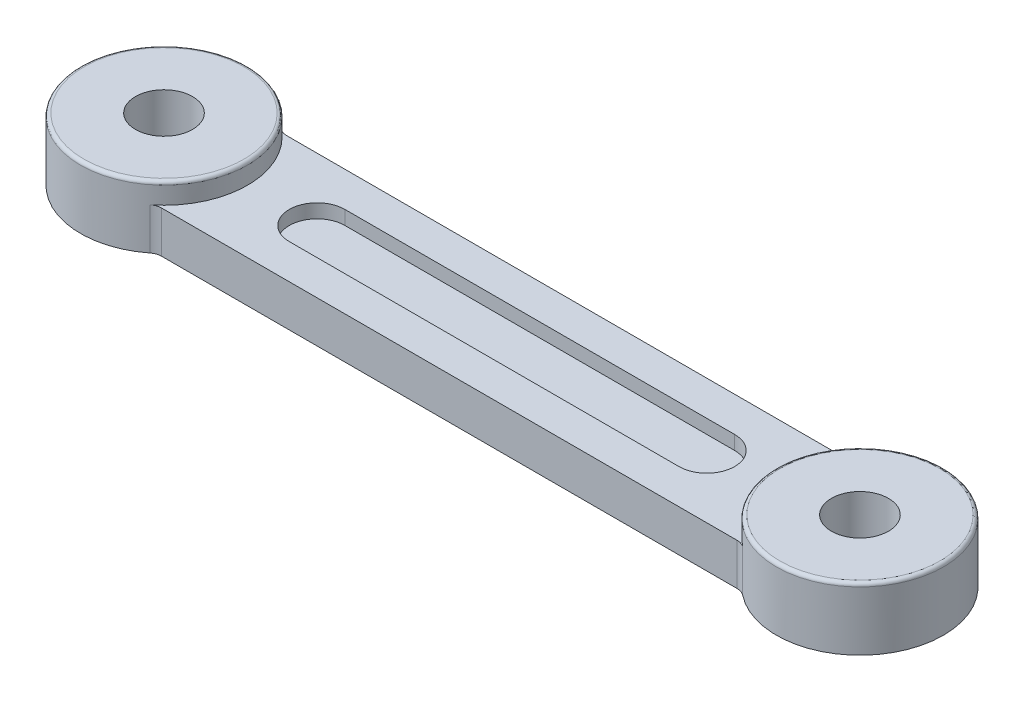
ISO-10303-21;
HEADER;
FILE_DESCRIPTION(('STEP AP214'),'2;1');
FILE_NAME('part.step','',(''),(''),'','','');
FILE_SCHEMA(('AUTOMOTIVE_DESIGN { 1 0 10303 214 1 1 1 1 }'));
ENDSEC;
DATA;
#1=APPLICATION_CONTEXT('core data for automotive mechanical design processes');
#2=APPLICATION_PROTOCOL_DEFINITION('international standard','automotive_design',2000,#1);
#3=PRODUCT_CONTEXT('',#1,'mechanical');
#4=PRODUCT('Part','Part','',(#3));
#5=PRODUCT_RELATED_PRODUCT_CATEGORY('part','',(#4));
#6=PRODUCT_DEFINITION_FORMATION('','',#4);
#7=PRODUCT_DEFINITION_CONTEXT('part definition',#1,'design');
#8=PRODUCT_DEFINITION('design','',#6,#7);
#9=PRODUCT_DEFINITION_SHAPE('','',#8);
#10=(LENGTH_UNIT() NAMED_UNIT(*) SI_UNIT(.MILLI.,.METRE.));
#11=(NAMED_UNIT(*) PLANE_ANGLE_UNIT() SI_UNIT($,.RADIAN.));
#12=(NAMED_UNIT(*) SI_UNIT($,.STERADIAN.) SOLID_ANGLE_UNIT());
#13=UNCERTAINTY_MEASURE_WITH_UNIT(LENGTH_MEASURE(1.E-05),#10,'distance_accuracy_value','');
#14=(GEOMETRIC_REPRESENTATION_CONTEXT(3) GLOBAL_UNCERTAINTY_ASSIGNED_CONTEXT((#13)) GLOBAL_UNIT_ASSIGNED_CONTEXT((#10,
#11,#12)) REPRESENTATION_CONTEXT('',''));
#15=CARTESIAN_POINT('',(0.,0.,0.));
#16=DIRECTION('',(0.,0.,1.));
#17=DIRECTION('',(1.,0.,0.));
#18=AXIS2_PLACEMENT_3D('',#15,#16,#17);
#19=CARTESIAN_POINT('',(-50.,6.,9.));
#20=DIRECTION('',(0.,0.,-1.));
#21=DIRECTION('',(-1.,0.,0.));
#22=AXIS2_PLACEMENT_3D('',#19,#20,#21);
#23=PLANE('',#22);
#24=DIRECTION('',(1.,0.,0.));
#25=VECTOR('',#24,1.);
#26=CARTESIAN_POINT('',(-50.,0.,9.));
#27=LINE('',#26,#25);
#28=CARTESIAN_POINT('',(-41.3397459621556,0.,9.));
#29=VERTEX_POINT('',#28);
#30=CARTESIAN_POINT('',(41.3397459621556,0.,8.99999999999998));
#31=VERTEX_POINT('',#30);
#32=EDGE_CURVE('E186',#29,#31,#27,.T.);
#33=ORIENTED_EDGE('',*,*,#32,.T.);
#34=DIRECTION('',(0.,1.,0.));
#35=VECTOR('',#34,1.);
#36=CARTESIAN_POINT('',(41.3397459621556,6.,8.99999999999998));
#37=LINE('',#36,#35);
#38=CARTESIAN_POINT('',(41.3397459621556,6.,8.99999999999998));
#39=VERTEX_POINT('',#38);
#40=EDGE_CURVE('E228',#31,#39,#37,.T.);
#41=ORIENTED_EDGE('',*,*,#40,.T.);
#42=DIRECTION('',(1.,0.,0.));
#43=VECTOR('',#42,1.);
#44=CARTESIAN_POINT('',(-50.,6.,9.));
#45=LINE('',#44,#43);
#46=CARTESIAN_POINT('',(-41.3397459621556,6.,9.));
#47=VERTEX_POINT('',#46);
#48=EDGE_CURVE('E187',#47,#39,#45,.T.);
#49=ORIENTED_EDGE('',*,*,#48,.F.);
#50=DIRECTION('',(0.,1.,0.));
#51=VECTOR('',#50,1.);
#52=CARTESIAN_POINT('',(-41.3397459621556,0.,9.));
#53=LINE('',#52,#51);
#54=EDGE_CURVE('E225',#47,#29,#53,.F.);
#55=ORIENTED_EDGE('',*,*,#54,.T.);
#56=EDGE_LOOP('',(#33,#41,#49,#55));
#57=FACE_BOUND('',#56,.T.);
#58=ADVANCED_FACE('F35',(#57),#23,.F.);
#59=CARTESIAN_POINT('',(-50.,6.,-9.));
#60=DIRECTION('',(0.,0.,1.));
#61=DIRECTION('',(1.,0.,0.));
#62=AXIS2_PLACEMENT_3D('',#59,#60,#61);
#63=PLANE('',#62);
#64=DIRECTION('',(-1.,0.,0.));
#65=VECTOR('',#64,1.);
#66=CARTESIAN_POINT('',(-50.,0.,-9.));
#67=LINE('',#66,#65);
#68=CARTESIAN_POINT('',(41.3397459621556,0.,-9.00000000000002));
#69=VERTEX_POINT('',#68);
#70=CARTESIAN_POINT('',(-41.3397459621556,0.,-9.));
#71=VERTEX_POINT('',#70);
#72=EDGE_CURVE('E190',#69,#71,#67,.T.);
#73=ORIENTED_EDGE('',*,*,#72,.T.);
#74=DIRECTION('',(0.,1.,0.));
#75=VECTOR('',#74,1.);
#76=CARTESIAN_POINT('',(-41.3397459621556,6.,-9.));
#77=LINE('',#76,#75);
#78=CARTESIAN_POINT('',(-41.3397459621556,6.,-9.));
#79=VERTEX_POINT('',#78);
#80=EDGE_CURVE('E212',#71,#79,#77,.T.);
#81=ORIENTED_EDGE('',*,*,#80,.T.);
#82=DIRECTION('',(-1.,0.,0.));
#83=VECTOR('',#82,1.);
#84=CARTESIAN_POINT('',(-50.,6.,-9.));
#85=LINE('',#84,#83);
#86=CARTESIAN_POINT('',(41.3397459621556,6.,-9.00000000000002));
#87=VERTEX_POINT('',#86);
#88=EDGE_CURVE('E189',#87,#79,#85,.T.);
#89=ORIENTED_EDGE('',*,*,#88,.F.);
#90=DIRECTION('',(0.,1.,0.));
#91=VECTOR('',#90,1.);
#92=CARTESIAN_POINT('',(41.3397459621556,0.,-9.00000000000002));
#93=LINE('',#92,#91);
#94=EDGE_CURVE('E209',#87,#69,#93,.F.);
#95=ORIENTED_EDGE('',*,*,#94,.T.);
#96=EDGE_LOOP('',(#73,#81,#89,#95));
#97=FACE_BOUND('',#96,.T.);
#98=ADVANCED_FACE('F271',(#97),#63,.F.);
#99=CARTESIAN_POINT('',(-50.,6.,0.));
#100=DIRECTION('',(0.,1.,0.));
#101=DIRECTION('',(0.,0.,1.));
#102=AXIS2_PLACEMENT_3D('',#99,#100,#101);
#103=PLANE('',#102);
#104=CARTESIAN_POINT('',(-28.,6.,0.));
#105=DIRECTION('',(0.,1.,0.));
#106=DIRECTION('',(0.,0.,1.));
#107=AXIS2_PLACEMENT_3D('',#104,#105,#106);
#108=CIRCLE('',#107,4.);
#109=CARTESIAN_POINT('',(-28.,6.,-4.));
#110=VERTEX_POINT('',#109);
#111=CARTESIAN_POINT('',(-28.,6.,4.));
#112=VERTEX_POINT('',#111);
#113=EDGE_CURVE('E132',#110,#112,#108,.T.);
#114=ORIENTED_EDGE('',*,*,#113,.F.);
#115=DIRECTION('',(-1.,0.,0.));
#116=VECTOR('',#115,1.);
#117=CARTESIAN_POINT('',(-28.,6.,-4.));
#118=LINE('',#117,#116);
#119=CARTESIAN_POINT('',(28.,6.,-4.));
#120=VERTEX_POINT('',#119);
#121=EDGE_CURVE('E149',#120,#110,#118,.T.);
#122=ORIENTED_EDGE('',*,*,#121,.F.);
#123=CARTESIAN_POINT('',(28.,6.,0.));
#124=DIRECTION('',(0.,1.,0.));
#125=DIRECTION('',(0.,0.,1.));
#126=AXIS2_PLACEMENT_3D('',#123,#124,#125);
#127=CIRCLE('',#126,4.);
#128=CARTESIAN_POINT('',(28.,6.,4.));
#129=VERTEX_POINT('',#128);
#130=EDGE_CURVE('E152',#129,#120,#127,.T.);
#131=ORIENTED_EDGE('',*,*,#130,.F.);
#132=DIRECTION('',(1.,0.,0.));
#133=VECTOR('',#132,1.);
#134=CARTESIAN_POINT('',(-28.,6.,4.));
#135=LINE('',#134,#133);
#136=EDGE_CURVE('E161',#112,#129,#135,.T.);
#137=ORIENTED_EDGE('',*,*,#136,.F.);
#138=EDGE_LOOP('',(#114,#122,#131,#137));
#139=FACE_BOUND('',#138,.T.);
#140=CARTESIAN_POINT('',(-50.,6.,0.));
#141=DIRECTION('',(0.,1.,0.));
#142=DIRECTION('',(0.,0.,1.));
#143=AXIS2_PLACEMENT_3D('',#140,#141,#142);
#144=CIRCLE('',#143,12.);
#145=CARTESIAN_POINT('',(-42.5769251104191,6.,9.42857142857143));
#146=VERTEX_POINT('',#145);
#147=CARTESIAN_POINT('',(-42.5769251104191,6.,-9.42857142857143));
#148=VERTEX_POINT('',#147);
#149=EDGE_CURVE('E184',#146,#148,#144,.T.);
#150=ORIENTED_EDGE('',*,*,#149,.F.);
#151=CARTESIAN_POINT('',(-41.3397459621556,6.,11.));
#152=DIRECTION('',(0.,1.,0.));
#153=DIRECTION('',(0.,0.,1.));
#154=AXIS2_PLACEMENT_3D('',#151,#152,#153);
#155=CIRCLE('',#154,2.);
#156=EDGE_CURVE('E11',#146,#47,#155,.F.);
#157=ORIENTED_EDGE('',*,*,#156,.T.);
#158=ORIENTED_EDGE('',*,*,#48,.T.);
#159=CARTESIAN_POINT('',(41.3397459621556,6.,11.));
#160=DIRECTION('',(0.,1.,0.));
#161=DIRECTION('',(0.,0.,1.));
#162=AXIS2_PLACEMENT_3D('',#159,#160,#161);
#163=CIRCLE('',#162,2.);
#164=CARTESIAN_POINT('',(42.5769251104191,6.,9.42857142857141));
#165=VERTEX_POINT('',#164);
#166=EDGE_CURVE('E50',#39,#165,#163,.F.);
#167=ORIENTED_EDGE('',*,*,#166,.T.);
#168=CARTESIAN_POINT('',(50.,6.,0.));
#169=DIRECTION('',(0.,1.,0.));
#170=DIRECTION('',(0.,0.,1.));
#171=AXIS2_PLACEMENT_3D('',#168,#169,#170);
#172=CIRCLE('',#171,12.);
#173=CARTESIAN_POINT('',(42.5769251104191,6.,-9.42857142857145));
#174=VERTEX_POINT('',#173);
#175=EDGE_CURVE('E174',#174,#165,#172,.T.);
#176=ORIENTED_EDGE('',*,*,#175,.F.);
#177=CARTESIAN_POINT('',(41.3397459621556,6.,-11.));
#178=DIRECTION('',(0.,1.,0.));
#179=DIRECTION('',(0.,0.,1.));
#180=AXIS2_PLACEMENT_3D('',#177,#178,#179);
#181=CIRCLE('',#180,2.);
#182=EDGE_CURVE('E237',#174,#87,#181,.F.);
#183=ORIENTED_EDGE('',*,*,#182,.T.);
#184=ORIENTED_EDGE('',*,*,#88,.T.);
#185=CARTESIAN_POINT('',(-41.3397459621556,6.,-11.));
#186=DIRECTION('',(0.,1.,0.));
#187=DIRECTION('',(0.,0.,1.));
#188=AXIS2_PLACEMENT_3D('',#185,#186,#187);
#189=CIRCLE('',#188,2.);
#190=EDGE_CURVE('E230',#79,#148,#189,.F.);
#191=ORIENTED_EDGE('',*,*,#190,.T.);
#192=EDGE_LOOP('',(#150,#157,#158,#167,#176,#183,#184,#191));
#193=FACE_BOUND('',#192,.T.);
#194=ADVANCED_FACE('F257',(#139,#193),#103,.T.);
#195=CARTESIAN_POINT('',(-50.,0.,0.));
#196=DIRECTION('',(0.,1.,0.));
#197=DIRECTION('',(0.,0.,1.));
#198=AXIS2_PLACEMENT_3D('',#195,#196,#197);
#199=PLANE('',#198);
#200=ORIENTED_EDGE('',*,*,#72,.F.);
#201=CARTESIAN_POINT('',(41.3397459621556,0.,-11.));
#202=DIRECTION('',(0.,1.,0.));
#203=DIRECTION('',(0.,0.,1.));
#204=AXIS2_PLACEMENT_3D('',#201,#202,#203);
#205=CIRCLE('',#204,2.);
#206=CARTESIAN_POINT('',(42.5769251104191,0.,-9.42857142857145));
#207=VERTEX_POINT('',#206);
#208=EDGE_CURVE('E235',#69,#207,#205,.T.);
#209=ORIENTED_EDGE('',*,*,#208,.T.);
#210=CARTESIAN_POINT('',(50.,0.,0.));
#211=DIRECTION('',(0.,-1.,0.));
#212=DIRECTION('',(0.,0.,-1.));
#213=AXIS2_PLACEMENT_3D('',#210,#211,#212);
#214=CIRCLE('',#213,12.);
#215=CARTESIAN_POINT('',(42.5769251104191,0.,9.42857142857141));
#216=VERTEX_POINT('',#215);
#217=EDGE_CURVE('E255',#207,#216,#214,.T.);
#218=ORIENTED_EDGE('',*,*,#217,.T.);
#219=CARTESIAN_POINT('',(41.3397459621556,0.,11.));
#220=DIRECTION('',(0.,1.,0.));
#221=DIRECTION('',(0.,0.,1.));
#222=AXIS2_PLACEMENT_3D('',#219,#220,#221);
#223=CIRCLE('',#222,2.);
#224=EDGE_CURVE('E240',#216,#31,#223,.T.);
#225=ORIENTED_EDGE('',*,*,#224,.T.);
#226=ORIENTED_EDGE('',*,*,#32,.F.);
#227=CARTESIAN_POINT('',(-41.3397459621556,0.,11.));
#228=DIRECTION('',(0.,1.,0.));
#229=DIRECTION('',(0.,0.,1.));
#230=AXIS2_PLACEMENT_3D('',#227,#228,#229);
#231=CIRCLE('',#230,2.);
#232=CARTESIAN_POINT('',(-42.5769251104191,0.,9.42857142857143));
#233=VERTEX_POINT('',#232);
#234=EDGE_CURVE('E43',#29,#233,#231,.T.);
#235=ORIENTED_EDGE('',*,*,#234,.T.);
#236=CARTESIAN_POINT('',(-50.,0.,0.));
#237=DIRECTION('',(0.,-1.,0.));
#238=DIRECTION('',(0.,0.,-1.));
#239=AXIS2_PLACEMENT_3D('',#236,#237,#238);
#240=CIRCLE('',#239,12.);
#241=CARTESIAN_POINT('',(-42.5769251104191,0.,-9.42857142857143));
#242=VERTEX_POINT('',#241);
#243=EDGE_CURVE('E155',#233,#242,#240,.T.);
#244=ORIENTED_EDGE('',*,*,#243,.T.);
#245=CARTESIAN_POINT('',(-41.3397459621556,0.,-11.));
#246=DIRECTION('',(0.,1.,0.));
#247=DIRECTION('',(0.,0.,1.));
#248=AXIS2_PLACEMENT_3D('',#245,#246,#247);
#249=CIRCLE('',#248,2.);
#250=EDGE_CURVE('E233',#242,#71,#249,.T.);
#251=ORIENTED_EDGE('',*,*,#250,.T.);
#252=EDGE_LOOP('',(#200,#209,#218,#225,#226,#235,#244,#251));
#253=FACE_BOUND('',#252,.T.);
#254=CARTESIAN_POINT('',(-50.,0.,0.));
#255=DIRECTION('',(0.,1.,0.));
#256=DIRECTION('',(0.,0.,1.));
#257=AXIS2_PLACEMENT_3D('',#254,#255,#256);
#258=CIRCLE('',#257,4.1);
#259=CARTESIAN_POINT('',(-50.,0.,4.1));
#260=VERTEX_POINT('',#259);
#261=EDGE_CURVE('E171',#260,#260,#258,.T.);
#262=ORIENTED_EDGE('',*,*,#261,.T.);
#263=EDGE_LOOP('',(#262));
#264=FACE_BOUND('',#263,.T.);
#265=CARTESIAN_POINT('',(50.,0.,0.));
#266=DIRECTION('',(0.,1.,0.));
#267=DIRECTION('',(0.,0.,1.));
#268=AXIS2_PLACEMENT_3D('',#265,#266,#267);
#269=CIRCLE('',#268,4.1);
#270=CARTESIAN_POINT('',(50.,0.,4.09999999999998));
#271=VERTEX_POINT('',#270);
#272=EDGE_CURVE('E178',#271,#271,#269,.T.);
#273=ORIENTED_EDGE('',*,*,#272,.T.);
#274=EDGE_LOOP('',(#273));
#275=FACE_BOUND('',#274,.T.);
#276=ADVANCED_FACE('F246',(#253,#264,#275),#199,.F.);
#277=CARTESIAN_POINT('',(-50.,9.,0.));
#278=DIRECTION('',(0.,-1.,0.));
#279=DIRECTION('',(0.,0.,-1.));
#280=AXIS2_PLACEMENT_3D('',#277,#278,#279);
#281=CYLINDRICAL_SURFACE('',#280,12.);
#282=CARTESIAN_POINT('',(-50.,8.5,0.));
#283=DIRECTION('',(0.,1.,0.));
#284=DIRECTION('',(0.,0.,1.));
#285=AXIS2_PLACEMENT_3D('',#282,#283,#284);
#286=CIRCLE('',#285,12.);
#287=CARTESIAN_POINT('',(-50.,8.5,12.));
#288=VERTEX_POINT('',#287);
#289=EDGE_CURVE('E206',#288,#288,#286,.F.);
#290=ORIENTED_EDGE('',*,*,#289,.T.);
#291=EDGE_LOOP('',(#290));
#292=FACE_BOUND('',#291,.T.);
#293=ORIENTED_EDGE('',*,*,#149,.T.);
#294=DIRECTION('',(0.,-1.,0.));
#295=VECTOR('',#294,1.);
#296=CARTESIAN_POINT('',(-42.5769251104191,9.,-9.42857142857143));
#297=LINE('',#296,#295);
#298=EDGE_CURVE('E218',#148,#242,#297,.T.);
#299=ORIENTED_EDGE('',*,*,#298,.T.);
#300=ORIENTED_EDGE('',*,*,#243,.F.);
#301=DIRECTION('',(0.,-1.,0.));
#302=VECTOR('',#301,1.);
#303=CARTESIAN_POINT('',(-42.5769251104191,9.,9.42857142857143));
#304=LINE('',#303,#302);
#305=EDGE_CURVE('E215',#233,#146,#304,.F.);
#306=ORIENTED_EDGE('',*,*,#305,.T.);
#307=EDGE_LOOP('',(#293,#299,#300,#306));
#308=FACE_BOUND('',#307,.T.);
#309=ADVANCED_FACE('F253',(#292,#308),#281,.T.);
#310=CARTESIAN_POINT('',(-50.,9.,0.));
#311=DIRECTION('',(0.,1.,0.));
#312=DIRECTION('',(0.,0.,1.));
#313=AXIS2_PLACEMENT_3D('',#310,#311,#312);
#314=PLANE('',#313);
#315=CARTESIAN_POINT('',(-50.,9.,0.));
#316=DIRECTION('',(0.,1.,0.));
#317=DIRECTION('',(0.,0.,1.));
#318=AXIS2_PLACEMENT_3D('',#315,#316,#317);
#319=CIRCLE('',#318,11.5);
#320=CARTESIAN_POINT('',(-50.,9.,11.5));
#321=VERTEX_POINT('',#320);
#322=EDGE_CURVE('E203',#321,#321,#319,.T.);
#323=ORIENTED_EDGE('',*,*,#322,.T.);
#324=EDGE_LOOP('',(#323));
#325=FACE_BOUND('',#324,.T.);
#326=CARTESIAN_POINT('',(-50.,9.,0.));
#327=DIRECTION('',(0.,1.,0.));
#328=DIRECTION('',(0.,0.,1.));
#329=AXIS2_PLACEMENT_3D('',#326,#327,#328);
#330=CIRCLE('',#329,4.1);
#331=CARTESIAN_POINT('',(-50.,9.,4.1));
#332=VERTEX_POINT('',#331);
#333=EDGE_CURVE('E175',#332,#332,#330,.T.);
#334=ORIENTED_EDGE('',*,*,#333,.F.);
#335=EDGE_LOOP('',(#334));
#336=FACE_BOUND('',#335,.T.);
#337=ADVANCED_FACE('F325',(#325,#336),#314,.T.);
#338=CARTESIAN_POINT('',(50.,9.,0.));
#339=DIRECTION('',(0.,-1.,0.));
#340=DIRECTION('',(0.,0.,-1.));
#341=AXIS2_PLACEMENT_3D('',#338,#339,#340);
#342=CYLINDRICAL_SURFACE('',#341,12.);
#343=CARTESIAN_POINT('',(50.,8.5,0.));
#344=DIRECTION('',(0.,1.,0.));
#345=DIRECTION('',(0.,0.,1.));
#346=AXIS2_PLACEMENT_3D('',#343,#344,#345);
#347=CIRCLE('',#346,12.);
#348=CARTESIAN_POINT('',(50.,8.5,12.));
#349=VERTEX_POINT('',#348);
#350=EDGE_CURVE('E200',#349,#349,#347,.F.);
#351=ORIENTED_EDGE('',*,*,#350,.T.);
#352=EDGE_LOOP('',(#351));
#353=FACE_BOUND('',#352,.T.);
#354=ORIENTED_EDGE('',*,*,#217,.F.);
#355=DIRECTION('',(0.,-1.,0.));
#356=VECTOR('',#355,1.);
#357=CARTESIAN_POINT('',(42.5769251104191,9.,-9.42857142857145));
#358=LINE('',#357,#356);
#359=EDGE_CURVE('E222',#207,#174,#358,.F.);
#360=ORIENTED_EDGE('',*,*,#359,.T.);
#361=ORIENTED_EDGE('',*,*,#175,.T.);
#362=DIRECTION('',(0.,-1.,0.));
#363=VECTOR('',#362,1.);
#364=CARTESIAN_POINT('',(42.5769251104191,9.,9.42857142857141));
#365=LINE('',#364,#363);
#366=EDGE_CURVE('E220',#165,#216,#365,.T.);
#367=ORIENTED_EDGE('',*,*,#366,.T.);
#368=EDGE_LOOP('',(#354,#360,#361,#367));
#369=FACE_BOUND('',#368,.T.);
#370=ADVANCED_FACE('F263',(#353,#369),#342,.T.);
#371=CARTESIAN_POINT('',(50.,9.,0.));
#372=DIRECTION('',(0.,1.,0.));
#373=DIRECTION('',(0.,0.,1.));
#374=AXIS2_PLACEMENT_3D('',#371,#372,#373);
#375=PLANE('',#374);
#376=CARTESIAN_POINT('',(50.,9.,0.));
#377=DIRECTION('',(0.,1.,0.));
#378=DIRECTION('',(0.,0.,1.));
#379=AXIS2_PLACEMENT_3D('',#376,#377,#378);
#380=CIRCLE('',#379,11.5);
#381=CARTESIAN_POINT('',(50.,9.,11.5));
#382=VERTEX_POINT('',#381);
#383=EDGE_CURVE('E193',#382,#382,#380,.T.);
#384=ORIENTED_EDGE('',*,*,#383,.T.);
#385=EDGE_LOOP('',(#384));
#386=FACE_BOUND('',#385,.T.);
#387=CARTESIAN_POINT('',(50.,9.,0.));
#388=DIRECTION('',(0.,1.,0.));
#389=DIRECTION('',(0.,0.,1.));
#390=AXIS2_PLACEMENT_3D('',#387,#388,#389);
#391=CIRCLE('',#390,4.1);
#392=CARTESIAN_POINT('',(50.,9.,4.09999999999998));
#393=VERTEX_POINT('',#392);
#394=EDGE_CURVE('E167',#393,#393,#391,.T.);
#395=ORIENTED_EDGE('',*,*,#394,.F.);
#396=EDGE_LOOP('',(#395));
#397=FACE_BOUND('',#396,.T.);
#398=ADVANCED_FACE('F304',(#386,#397),#375,.T.);
#399=CARTESIAN_POINT('',(50.,0.,0.));
#400=DIRECTION('',(0.,1.,0.));
#401=DIRECTION('',(0.,0.,1.));
#402=AXIS2_PLACEMENT_3D('',#399,#400,#401);
#403=CYLINDRICAL_SURFACE('',#402,4.1);
#404=ORIENTED_EDGE('',*,*,#272,.F.);
#405=EDGE_LOOP('',(#404));
#406=FACE_BOUND('',#405,.T.);
#407=ORIENTED_EDGE('',*,*,#394,.T.);
#408=EDGE_LOOP('',(#407));
#409=FACE_BOUND('',#408,.T.);
#410=ADVANCED_FACE('F307',(#406,#409),#403,.F.);
#411=CARTESIAN_POINT('',(-50.,0.,0.));
#412=DIRECTION('',(0.,1.,0.));
#413=DIRECTION('',(0.,0.,1.));
#414=AXIS2_PLACEMENT_3D('',#411,#412,#413);
#415=CYLINDRICAL_SURFACE('',#414,4.1);
#416=ORIENTED_EDGE('',*,*,#261,.F.);
#417=EDGE_LOOP('',(#416));
#418=FACE_BOUND('',#417,.T.);
#419=ORIENTED_EDGE('',*,*,#333,.T.);
#420=EDGE_LOOP('',(#419));
#421=FACE_BOUND('',#420,.T.);
#422=ADVANCED_FACE('F312',(#418,#421),#415,.F.);
#423=CARTESIAN_POINT('',(-28.,4.,0.));
#424=DIRECTION('',(0.,1.,0.));
#425=DIRECTION('',(0.,0.,1.));
#426=AXIS2_PLACEMENT_3D('',#423,#424,#425);
#427=CYLINDRICAL_SURFACE('',#426,4.);
#428=ORIENTED_EDGE('',*,*,#113,.T.);
#429=DIRECTION('',(0.,1.,0.));
#430=VECTOR('',#429,1.);
#431=CARTESIAN_POINT('',(-28.,4.,4.));
#432=LINE('',#431,#430);
#433=CARTESIAN_POINT('',(-28.,4.,4.));
#434=VERTEX_POINT('',#433);
#435=EDGE_CURVE('E125',#434,#112,#432,.T.);
#436=ORIENTED_EDGE('',*,*,#435,.F.);
#437=CARTESIAN_POINT('',(-28.,4.,0.));
#438=DIRECTION('',(0.,1.,0.));
#439=DIRECTION('',(0.,0.,1.));
#440=AXIS2_PLACEMENT_3D('',#437,#438,#439);
#441=CIRCLE('',#440,4.);
#442=CARTESIAN_POINT('',(-28.,4.,-4.));
#443=VERTEX_POINT('',#442);
#444=EDGE_CURVE('E129',#443,#434,#441,.T.);
#445=ORIENTED_EDGE('',*,*,#444,.F.);
#446=DIRECTION('',(0.,1.,0.));
#447=VECTOR('',#446,1.);
#448=CARTESIAN_POINT('',(-28.,4.,-4.));
#449=LINE('',#448,#447);
#450=EDGE_CURVE('E165',#443,#110,#449,.T.);
#451=ORIENTED_EDGE('',*,*,#450,.T.);
#452=EDGE_LOOP('',(#428,#436,#445,#451));
#453=FACE_BOUND('',#452,.T.);
#454=ADVANCED_FACE('F127',(#453),#427,.F.);
#455=CARTESIAN_POINT('',(-28.,4.,-4.));
#456=DIRECTION('',(0.,0.,-1.));
#457=DIRECTION('',(-1.,0.,0.));
#458=AXIS2_PLACEMENT_3D('',#455,#456,#457);
#459=PLANE('',#458);
#460=ORIENTED_EDGE('',*,*,#121,.T.);
#461=ORIENTED_EDGE('',*,*,#450,.F.);
#462=DIRECTION('',(-1.,0.,0.));
#463=VECTOR('',#462,1.);
#464=CARTESIAN_POINT('',(-28.,4.,-4.));
#465=LINE('',#464,#463);
#466=CARTESIAN_POINT('',(28.,4.,-4.));
#467=VERTEX_POINT('',#466);
#468=EDGE_CURVE('E137',#467,#443,#465,.T.);
#469=ORIENTED_EDGE('',*,*,#468,.F.);
#470=DIRECTION('',(0.,1.,0.));
#471=VECTOR('',#470,1.);
#472=CARTESIAN_POINT('',(28.,4.,-4.));
#473=LINE('',#472,#471);
#474=EDGE_CURVE('E168',#467,#120,#473,.T.);
#475=ORIENTED_EDGE('',*,*,#474,.T.);
#476=EDGE_LOOP('',(#460,#461,#469,#475));
#477=FACE_BOUND('',#476,.T.);
#478=ADVANCED_FACE('F445',(#477),#459,.F.);
#479=CARTESIAN_POINT('',(28.,4.,0.));
#480=DIRECTION('',(0.,1.,0.));
#481=DIRECTION('',(0.,0.,1.));
#482=AXIS2_PLACEMENT_3D('',#479,#480,#481);
#483=CYLINDRICAL_SURFACE('',#482,4.);
#484=ORIENTED_EDGE('',*,*,#130,.T.);
#485=ORIENTED_EDGE('',*,*,#474,.F.);
#486=CARTESIAN_POINT('',(28.,4.,0.));
#487=DIRECTION('',(0.,1.,0.));
#488=DIRECTION('',(0.,0.,1.));
#489=AXIS2_PLACEMENT_3D('',#486,#487,#488);
#490=CIRCLE('',#489,4.);
#491=CARTESIAN_POINT('',(28.,4.,4.));
#492=VERTEX_POINT('',#491);
#493=EDGE_CURVE('E145',#492,#467,#490,.T.);
#494=ORIENTED_EDGE('',*,*,#493,.F.);
#495=DIRECTION('',(0.,1.,0.));
#496=VECTOR('',#495,1.);
#497=CARTESIAN_POINT('',(28.,4.,4.));
#498=LINE('',#497,#496);
#499=EDGE_CURVE('E136',#492,#129,#498,.T.);
#500=ORIENTED_EDGE('',*,*,#499,.T.);
#501=EDGE_LOOP('',(#484,#485,#494,#500));
#502=FACE_BOUND('',#501,.T.);
#503=ADVANCED_FACE('F450',(#502),#483,.F.);
#504=CARTESIAN_POINT('',(-28.,4.,4.));
#505=DIRECTION('',(0.,0.,1.));
#506=DIRECTION('',(1.,0.,0.));
#507=AXIS2_PLACEMENT_3D('',#504,#505,#506);
#508=PLANE('',#507);
#509=ORIENTED_EDGE('',*,*,#136,.T.);
#510=ORIENTED_EDGE('',*,*,#499,.F.);
#511=DIRECTION('',(1.,0.,0.));
#512=VECTOR('',#511,1.);
#513=CARTESIAN_POINT('',(-28.,4.,4.));
#514=LINE('',#513,#512);
#515=EDGE_CURVE('E140',#434,#492,#514,.T.);
#516=ORIENTED_EDGE('',*,*,#515,.F.);
#517=ORIENTED_EDGE('',*,*,#435,.T.);
#518=EDGE_LOOP('',(#509,#510,#516,#517));
#519=FACE_BOUND('',#518,.T.);
#520=ADVANCED_FACE('F141',(#519),#508,.F.);
#521=CARTESIAN_POINT('',(-28.,4.,0.));
#522=DIRECTION('',(0.,1.,0.));
#523=DIRECTION('',(0.,0.,1.));
#524=AXIS2_PLACEMENT_3D('',#521,#522,#523);
#525=PLANE('',#524);
#526=ORIENTED_EDGE('',*,*,#444,.T.);
#527=ORIENTED_EDGE('',*,*,#515,.T.);
#528=ORIENTED_EDGE('',*,*,#493,.T.);
#529=ORIENTED_EDGE('',*,*,#468,.T.);
#530=EDGE_LOOP('',(#526,#527,#528,#529));
#531=FACE_BOUND('',#530,.T.);
#532=ADVANCED_FACE('F147',(#531),#525,.T.);
#533=CARTESIAN_POINT('',(50.,8.5,0.));
#534=DIRECTION('',(0.,1.,0.));
#535=DIRECTION('',(0.,0.,1.));
#536=AXIS2_PLACEMENT_3D('',#533,#534,#535);
#537=TOROIDAL_SURFACE('',#536,11.5,0.5);
#538=ORIENTED_EDGE('',*,*,#350,.F.);
#539=EDGE_LOOP('',(#538));
#540=FACE_BOUND('',#539,.T.);
#541=ORIENTED_EDGE('',*,*,#383,.F.);
#542=EDGE_LOOP('',(#541));
#543=FACE_BOUND('',#542,.T.);
#544=ADVANCED_FACE('F283',(#540,#543),#537,.T.);
#545=CARTESIAN_POINT('',(-50.,8.5,0.));
#546=DIRECTION('',(0.,1.,0.));
#547=DIRECTION('',(0.,0.,1.));
#548=AXIS2_PLACEMENT_3D('',#545,#546,#547);
#549=TOROIDAL_SURFACE('',#548,11.5,0.5);
#550=ORIENTED_EDGE('',*,*,#289,.F.);
#551=EDGE_LOOP('',(#550));
#552=FACE_BOUND('',#551,.T.);
#553=ORIENTED_EDGE('',*,*,#322,.F.);
#554=EDGE_LOOP('',(#553));
#555=FACE_BOUND('',#554,.T.);
#556=ADVANCED_FACE('F276',(#552,#555),#549,.T.);
#557=CARTESIAN_POINT('',(-41.3397459621556,9.,-11.));
#558=DIRECTION('',(0.,-1.,0.));
#559=DIRECTION('',(0.,0.,-1.));
#560=AXIS2_PLACEMENT_3D('',#557,#558,#559);
#561=CYLINDRICAL_SURFACE('',#560,2.);
#562=ORIENTED_EDGE('',*,*,#250,.F.);
#563=ORIENTED_EDGE('',*,*,#298,.F.);
#564=ORIENTED_EDGE('',*,*,#190,.F.);
#565=ORIENTED_EDGE('',*,*,#80,.F.);
#566=EDGE_LOOP('',(#562,#563,#564,#565));
#567=FACE_BOUND('',#566,.T.);
#568=ADVANCED_FACE('F274',(#567),#561,.F.);
#569=CARTESIAN_POINT('',(41.3397459621556,9.,-11.));
#570=DIRECTION('',(0.,-1.,0.));
#571=DIRECTION('',(0.,0.,-1.));
#572=AXIS2_PLACEMENT_3D('',#569,#570,#571);
#573=CYLINDRICAL_SURFACE('',#572,2.);
#574=ORIENTED_EDGE('',*,*,#182,.F.);
#575=ORIENTED_EDGE('',*,*,#359,.F.);
#576=ORIENTED_EDGE('',*,*,#208,.F.);
#577=ORIENTED_EDGE('',*,*,#94,.F.);
#578=EDGE_LOOP('',(#574,#575,#576,#577));
#579=FACE_BOUND('',#578,.T.);
#580=ADVANCED_FACE('F268',(#579),#573,.F.);
#581=CARTESIAN_POINT('',(41.3397459621556,9.,11.));
#582=DIRECTION('',(0.,-1.,0.));
#583=DIRECTION('',(0.,0.,-1.));
#584=AXIS2_PLACEMENT_3D('',#581,#582,#583);
#585=CYLINDRICAL_SURFACE('',#584,2.);
#586=ORIENTED_EDGE('',*,*,#224,.F.);
#587=ORIENTED_EDGE('',*,*,#366,.F.);
#588=ORIENTED_EDGE('',*,*,#166,.F.);
#589=ORIENTED_EDGE('',*,*,#40,.F.);
#590=EDGE_LOOP('',(#586,#587,#588,#589));
#591=FACE_BOUND('',#590,.T.);
#592=ADVANCED_FACE('F259',(#591),#585,.F.);
#593=CARTESIAN_POINT('',(-41.3397459621556,9.,11.));
#594=DIRECTION('',(0.,-1.,0.));
#595=DIRECTION('',(0.,0.,-1.));
#596=AXIS2_PLACEMENT_3D('',#593,#594,#595);
#597=CYLINDRICAL_SURFACE('',#596,2.);
#598=ORIENTED_EDGE('',*,*,#156,.F.);
#599=ORIENTED_EDGE('',*,*,#305,.F.);
#600=ORIENTED_EDGE('',*,*,#234,.F.);
#601=ORIENTED_EDGE('',*,*,#54,.F.);
#602=EDGE_LOOP('',(#598,#599,#600,#601));
#603=FACE_BOUND('',#602,.T.);
#604=ADVANCED_FACE('F37',(#603),#597,.F.);
#605=CLOSED_SHELL('',(#58,#98,#194,#276,#309,#337,#370,#398,#410,#422,#454,#478,#503,#520,#532,
#544,#556,#568,#580,#592,#604));
#606=MANIFOLD_SOLID_BREP('B2',#605);
#607=ADVANCED_BREP_SHAPE_REPRESENTATION('',(#18,#606),#14);
#608=SHAPE_DEFINITION_REPRESENTATION(#9,#607);
ENDSEC;
END-ISO-10303-21;
